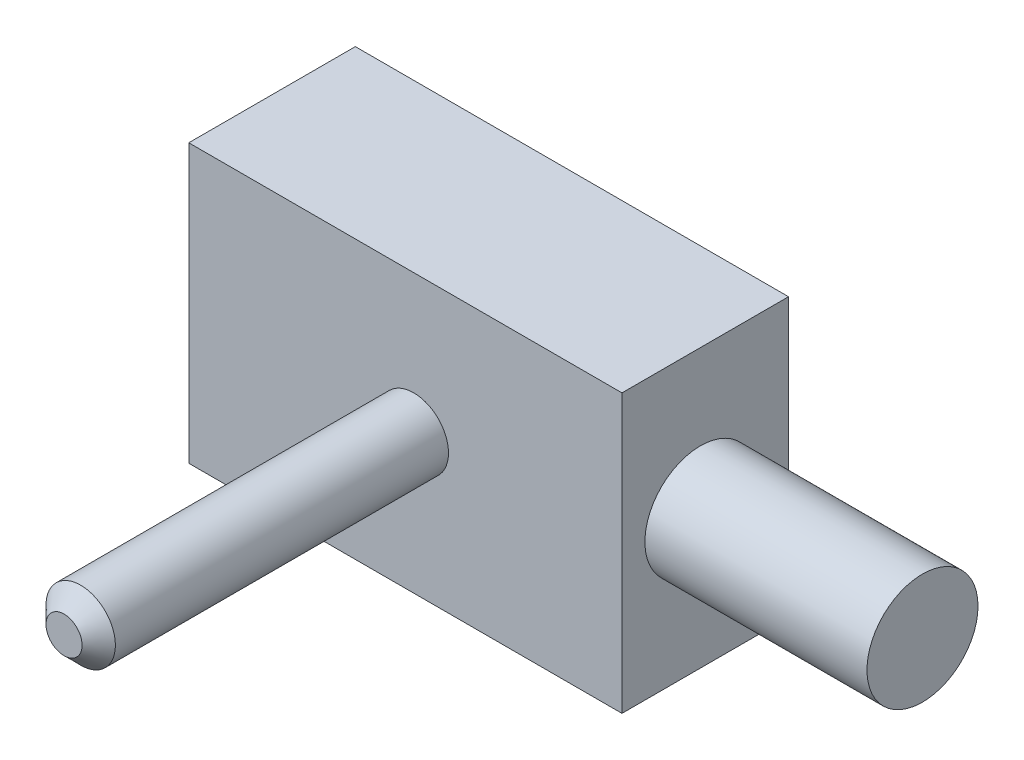
ISO-10303-21;
HEADER;
FILE_DESCRIPTION(('STEP AP214'),'2;1');
FILE_NAME('part.step','',(''),(''),'','','');
FILE_SCHEMA(('AUTOMOTIVE_DESIGN { 1 0 10303 214 1 1 1 1 }'));
ENDSEC;
DATA;
#1=APPLICATION_CONTEXT('core data for automotive mechanical design processes');
#2=APPLICATION_PROTOCOL_DEFINITION('international standard','automotive_design',2000,#1);
#3=PRODUCT_CONTEXT('',#1,'mechanical');
#4=PRODUCT('Part','Part','',(#3));
#5=PRODUCT_RELATED_PRODUCT_CATEGORY('part','',(#4));
#6=PRODUCT_DEFINITION_FORMATION('','',#4);
#7=PRODUCT_DEFINITION_CONTEXT('part definition',#1,'design');
#8=PRODUCT_DEFINITION('design','',#6,#7);
#9=PRODUCT_DEFINITION_SHAPE('','',#8);
#10=(LENGTH_UNIT() NAMED_UNIT(*) SI_UNIT(.MILLI.,.METRE.));
#11=(NAMED_UNIT(*) PLANE_ANGLE_UNIT() SI_UNIT($,.RADIAN.));
#12=(NAMED_UNIT(*) SI_UNIT($,.STERADIAN.) SOLID_ANGLE_UNIT());
#13=UNCERTAINTY_MEASURE_WITH_UNIT(LENGTH_MEASURE(1.E-05),#10,'distance_accuracy_value','');
#14=(GEOMETRIC_REPRESENTATION_CONTEXT(3) GLOBAL_UNCERTAINTY_ASSIGNED_CONTEXT((#13)) GLOBAL_UNIT_ASSIGNED_CONTEXT((#10,
#11,#12)) REPRESENTATION_CONTEXT('',''));
#15=CARTESIAN_POINT('',(0.,0.,0.));
#16=DIRECTION('',(0.,0.,1.));
#17=DIRECTION('',(1.,0.,0.));
#18=AXIS2_PLACEMENT_3D('',#15,#16,#17);
#19=CARTESIAN_POINT('',(-39.015,-25.,30.));
#20=DIRECTION('',(1.,0.,0.));
#21=DIRECTION('',(0.,0.,-1.));
#22=AXIS2_PLACEMENT_3D('',#19,#20,#21);
#23=PLANE('',#22);
#24=DIRECTION('',(0.,-1.,0.));
#25=VECTOR('',#24,1.);
#26=CARTESIAN_POINT('',(-39.015,-25.,0.));
#27=LINE('',#26,#25);
#28=CARTESIAN_POINT('',(-39.015,25.,0.));
#29=VERTEX_POINT('',#28);
#30=CARTESIAN_POINT('',(-39.015,-25.,0.));
#31=VERTEX_POINT('',#30);
#32=EDGE_CURVE('E115',#29,#31,#27,.T.);
#33=ORIENTED_EDGE('',*,*,#32,.T.);
#34=DIRECTION('',(0.,0.,-1.));
#35=VECTOR('',#34,1.);
#36=CARTESIAN_POINT('',(-39.015,-25.,30.));
#37=LINE('',#36,#35);
#38=CARTESIAN_POINT('',(-39.015,-25.,30.));
#39=VERTEX_POINT('',#38);
#40=EDGE_CURVE('E104',#39,#31,#37,.T.);
#41=ORIENTED_EDGE('',*,*,#40,.F.);
#42=DIRECTION('',(0.,-1.,0.));
#43=VECTOR('',#42,1.);
#44=CARTESIAN_POINT('',(-39.015,-25.,30.));
#45=LINE('',#44,#43);
#46=CARTESIAN_POINT('',(-39.015,25.,30.));
#47=VERTEX_POINT('',#46);
#48=EDGE_CURVE('E96',#47,#39,#45,.T.);
#49=ORIENTED_EDGE('',*,*,#48,.F.);
#50=DIRECTION('',(0.,0.,-1.));
#51=VECTOR('',#50,1.);
#52=CARTESIAN_POINT('',(-39.015,25.,30.));
#53=LINE('',#52,#51);
#54=EDGE_CURVE('E111',#47,#29,#53,.T.);
#55=ORIENTED_EDGE('',*,*,#54,.T.);
#56=EDGE_LOOP('',(#33,#41,#49,#55));
#57=FACE_BOUND('',#56,.T.);
#58=ADVANCED_FACE('F41',(#57),#23,.F.);
#59=CARTESIAN_POINT('',(39.015,-25.,30.));
#60=DIRECTION('',(0.,1.,0.));
#61=DIRECTION('',(-1.,0.,0.));
#62=AXIS2_PLACEMENT_3D('',#59,#60,#61);
#63=PLANE('',#62);
#64=DIRECTION('',(1.,0.,0.));
#65=VECTOR('',#64,1.);
#66=CARTESIAN_POINT('',(39.015,-25.,0.));
#67=LINE('',#66,#65);
#68=CARTESIAN_POINT('',(39.015,-25.,0.));
#69=VERTEX_POINT('',#68);
#70=EDGE_CURVE('E102',#31,#69,#67,.T.);
#71=ORIENTED_EDGE('',*,*,#70,.T.);
#72=DIRECTION('',(0.,0.,-1.));
#73=VECTOR('',#72,1.);
#74=CARTESIAN_POINT('',(39.015,-25.,30.));
#75=LINE('',#74,#73);
#76=CARTESIAN_POINT('',(39.015,-25.,30.));
#77=VERTEX_POINT('',#76);
#78=EDGE_CURVE('E100',#77,#69,#75,.T.);
#79=ORIENTED_EDGE('',*,*,#78,.F.);
#80=DIRECTION('',(1.,0.,0.));
#81=VECTOR('',#80,1.);
#82=CARTESIAN_POINT('',(39.015,-25.,30.));
#83=LINE('',#82,#81);
#84=EDGE_CURVE('E91',#39,#77,#83,.T.);
#85=ORIENTED_EDGE('',*,*,#84,.F.);
#86=ORIENTED_EDGE('',*,*,#40,.T.);
#87=EDGE_LOOP('',(#71,#79,#85,#86));
#88=FACE_BOUND('',#87,.T.);
#89=ADVANCED_FACE('F101',(#88),#63,.F.);
#90=CARTESIAN_POINT('',(39.015,-25.,30.));
#91=DIRECTION('',(-1.,0.,0.));
#92=DIRECTION('',(0.,0.,1.));
#93=AXIS2_PLACEMENT_3D('',#90,#91,#92);
#94=PLANE('',#93);
#95=CARTESIAN_POINT('',(39.015,-0.319999999999994,15.87));
#96=DIRECTION('',(1.,0.,0.));
#97=DIRECTION('',(0.,0.,-1.));
#98=AXIS2_PLACEMENT_3D('',#95,#96,#97);
#99=CIRCLE('',#98,10.);
#100=CARTESIAN_POINT('',(39.015,-0.319999999999994,5.86999999999999));
#101=VERTEX_POINT('',#100);
#102=EDGE_CURVE('E131',#101,#101,#99,.T.);
#103=ORIENTED_EDGE('',*,*,#102,.F.);
#104=EDGE_LOOP('',(#103));
#105=FACE_BOUND('',#104,.T.);
#106=DIRECTION('',(0.,1.,0.));
#107=VECTOR('',#106,1.);
#108=CARTESIAN_POINT('',(39.015,-25.,0.));
#109=LINE('',#108,#107);
#110=CARTESIAN_POINT('',(39.015,25.,0.));
#111=VERTEX_POINT('',#110);
#112=EDGE_CURVE('E77',#69,#111,#109,.T.);
#113=ORIENTED_EDGE('',*,*,#112,.T.);
#114=DIRECTION('',(0.,0.,-1.));
#115=VECTOR('',#114,1.);
#116=CARTESIAN_POINT('',(39.015,25.,30.));
#117=LINE('',#116,#115);
#118=CARTESIAN_POINT('',(39.015,25.,30.));
#119=VERTEX_POINT('',#118);
#120=EDGE_CURVE('E105',#119,#111,#117,.T.);
#121=ORIENTED_EDGE('',*,*,#120,.F.);
#122=DIRECTION('',(0.,1.,0.));
#123=VECTOR('',#122,1.);
#124=CARTESIAN_POINT('',(39.015,-25.,30.));
#125=LINE('',#124,#123);
#126=EDGE_CURVE('E94',#77,#119,#125,.T.);
#127=ORIENTED_EDGE('',*,*,#126,.F.);
#128=ORIENTED_EDGE('',*,*,#78,.T.);
#129=EDGE_LOOP('',(#113,#121,#127,#128));
#130=FACE_BOUND('',#129,.T.);
#131=ADVANCED_FACE('F107',(#105,#130),#94,.F.);
#132=CARTESIAN_POINT('',(39.015,25.,30.));
#133=DIRECTION('',(0.,-1.,0.));
#134=DIRECTION('',(1.,0.,0.));
#135=AXIS2_PLACEMENT_3D('',#132,#133,#134);
#136=PLANE('',#135);
#137=DIRECTION('',(-1.,0.,0.));
#138=VECTOR('',#137,1.);
#139=CARTESIAN_POINT('',(39.015,25.,0.));
#140=LINE('',#139,#138);
#141=EDGE_CURVE('E83',#111,#29,#140,.T.);
#142=ORIENTED_EDGE('',*,*,#141,.T.);
#143=ORIENTED_EDGE('',*,*,#54,.F.);
#144=DIRECTION('',(-1.,0.,0.));
#145=VECTOR('',#144,1.);
#146=CARTESIAN_POINT('',(39.015,25.,30.));
#147=LINE('',#146,#145);
#148=EDGE_CURVE('E60',#119,#47,#147,.T.);
#149=ORIENTED_EDGE('',*,*,#148,.F.);
#150=ORIENTED_EDGE('',*,*,#120,.T.);
#151=EDGE_LOOP('',(#142,#143,#149,#150));
#152=FACE_BOUND('',#151,.T.);
#153=ADVANCED_FACE('F161',(#152),#136,.F.);
#154=CARTESIAN_POINT('',(0.,0.,30.));
#155=DIRECTION('',(0.,0.,1.));
#156=DIRECTION('',(1.,0.,0.));
#157=AXIS2_PLACEMENT_3D('',#154,#155,#156);
#158=PLANE('',#157);
#159=CARTESIAN_POINT('',(1.515,0.,30.));
#160=DIRECTION('',(0.,0.,1.));
#161=DIRECTION('',(1.,0.,0.));
#162=AXIS2_PLACEMENT_3D('',#159,#160,#161);
#163=CIRCLE('',#162,6.25);
#164=CARTESIAN_POINT('',(7.765,0.,30.));
#165=VERTEX_POINT('',#164);
#166=EDGE_CURVE('E134',#165,#165,#163,.T.);
#167=ORIENTED_EDGE('',*,*,#166,.F.);
#168=EDGE_LOOP('',(#167));
#169=FACE_BOUND('',#168,.T.);
#170=ORIENTED_EDGE('',*,*,#48,.T.);
#171=ORIENTED_EDGE('',*,*,#84,.T.);
#172=ORIENTED_EDGE('',*,*,#126,.T.);
#173=ORIENTED_EDGE('',*,*,#148,.T.);
#174=EDGE_LOOP('',(#170,#171,#172,#173));
#175=FACE_BOUND('',#174,.T.);
#176=ADVANCED_FACE('F92',(#169,#175),#158,.T.);
#177=CARTESIAN_POINT('',(0.,0.,0.));
#178=DIRECTION('',(0.,0.,1.));
#179=DIRECTION('',(1.,0.,0.));
#180=AXIS2_PLACEMENT_3D('',#177,#178,#179);
#181=PLANE('',#180);
#182=ORIENTED_EDGE('',*,*,#32,.F.);
#183=ORIENTED_EDGE('',*,*,#141,.F.);
#184=ORIENTED_EDGE('',*,*,#112,.F.);
#185=ORIENTED_EDGE('',*,*,#70,.F.);
#186=EDGE_LOOP('',(#182,#183,#184,#185));
#187=FACE_BOUND('',#186,.T.);
#188=ADVANCED_FACE('F156',(#187),#181,.F.);
#189=CARTESIAN_POINT('',(79.015,-0.319999999999994,15.87));
#190=DIRECTION('',(-1.,0.,0.));
#191=DIRECTION('',(0.,0.,1.));
#192=AXIS2_PLACEMENT_3D('',#189,#190,#191);
#193=CYLINDRICAL_SURFACE('',#192,10.);
#194=CARTESIAN_POINT('',(79.015,-0.319999999999994,15.87));
#195=DIRECTION('',(1.,0.,0.));
#196=DIRECTION('',(0.,0.,-1.));
#197=AXIS2_PLACEMENT_3D('',#194,#195,#196);
#198=CIRCLE('',#197,10.);
#199=CARTESIAN_POINT('',(79.015,-0.319999999999994,5.86999999999999));
#200=VERTEX_POINT('',#199);
#201=EDGE_CURVE('E119',#200,#200,#198,.T.);
#202=ORIENTED_EDGE('',*,*,#201,.F.);
#203=EDGE_LOOP('',(#202));
#204=FACE_BOUND('',#203,.T.);
#205=ORIENTED_EDGE('',*,*,#102,.T.);
#206=EDGE_LOOP('',(#205));
#207=FACE_BOUND('',#206,.T.);
#208=ADVANCED_FACE('F153',(#204,#207),#193,.T.);
#209=CARTESIAN_POINT('',(79.015,-0.319999999999994,15.87));
#210=DIRECTION('',(1.,0.,0.));
#211=DIRECTION('',(0.,0.,-1.));
#212=AXIS2_PLACEMENT_3D('',#209,#210,#211);
#213=PLANE('',#212);
#214=ORIENTED_EDGE('',*,*,#201,.T.);
#215=EDGE_LOOP('',(#214));
#216=FACE_BOUND('',#215,.T.);
#217=ADVANCED_FACE('F151',(#216),#213,.T.);
#218=CARTESIAN_POINT('',(1.515,0.,93.));
#219=DIRECTION('',(0.,0.,-1.));
#220=DIRECTION('',(-1.,0.,0.));
#221=AXIS2_PLACEMENT_3D('',#218,#219,#220);
#222=CYLINDRICAL_SURFACE('',#221,6.25);
#223=CARTESIAN_POINT('',(1.515,0.,90.));
#224=DIRECTION('',(0.,0.,1.));
#225=DIRECTION('',(1.,0.,0.));
#226=AXIS2_PLACEMENT_3D('',#223,#224,#225);
#227=CIRCLE('',#226,6.25);
#228=CARTESIAN_POINT('',(7.765,0.,90.));
#229=VERTEX_POINT('',#228);
#230=EDGE_CURVE('E11',#229,#229,#227,.F.);
#231=ORIENTED_EDGE('',*,*,#230,.T.);
#232=EDGE_LOOP('',(#231));
#233=FACE_BOUND('',#232,.T.);
#234=ORIENTED_EDGE('',*,*,#166,.T.);
#235=EDGE_LOOP('',(#234));
#236=FACE_BOUND('',#235,.T.);
#237=ADVANCED_FACE('F185',(#233,#236),#222,.T.);
#238=CARTESIAN_POINT('',(1.515,0.,93.));
#239=DIRECTION('',(0.,0.,1.));
#240=DIRECTION('',(1.,0.,0.));
#241=AXIS2_PLACEMENT_3D('',#238,#239,#240);
#242=PLANE('',#241);
#243=CARTESIAN_POINT('',(1.515,0.,93.));
#244=DIRECTION('',(0.,0.,1.));
#245=DIRECTION('',(1.,0.,0.));
#246=AXIS2_PLACEMENT_3D('',#243,#244,#245);
#247=CIRCLE('',#246,3.24999999999999);
#248=CARTESIAN_POINT('',(4.76499999999998,0.,93.));
#249=VERTEX_POINT('',#248);
#250=EDGE_CURVE('E52',#249,#249,#247,.T.);
#251=ORIENTED_EDGE('',*,*,#250,.T.);
#252=EDGE_LOOP('',(#251));
#253=FACE_BOUND('',#252,.T.);
#254=ADVANCED_FACE('F188',(#253),#242,.T.);
#255=CARTESIAN_POINT('',(1.515,0.,93.));
#256=DIRECTION('',(0.,0.,-1.));
#257=DIRECTION('',(-1.,0.,0.));
#258=AXIS2_PLACEMENT_3D('',#255,#256,#257);
#259=CONICAL_SURFACE('',#258,3.24999999999999,0.785398163397447);
#260=ORIENTED_EDGE('',*,*,#230,.F.);
#261=EDGE_LOOP('',(#260));
#262=FACE_BOUND('',#261,.T.);
#263=ORIENTED_EDGE('',*,*,#250,.F.);
#264=EDGE_LOOP('',(#263));
#265=FACE_BOUND('',#264,.T.);
#266=ADVANCED_FACE('F44',(#262,#265),#259,.T.);
#267=CLOSED_SHELL('',(#58,#89,#131,#153,#176,#188,#208,#217,#237,#254,#266));
#268=MANIFOLD_SOLID_BREP('B2',#267);
#269=ADVANCED_BREP_SHAPE_REPRESENTATION('',(#18,#268),#14);
#270=SHAPE_DEFINITION_REPRESENTATION(#9,#269);
ENDSEC;
END-ISO-10303-21;
